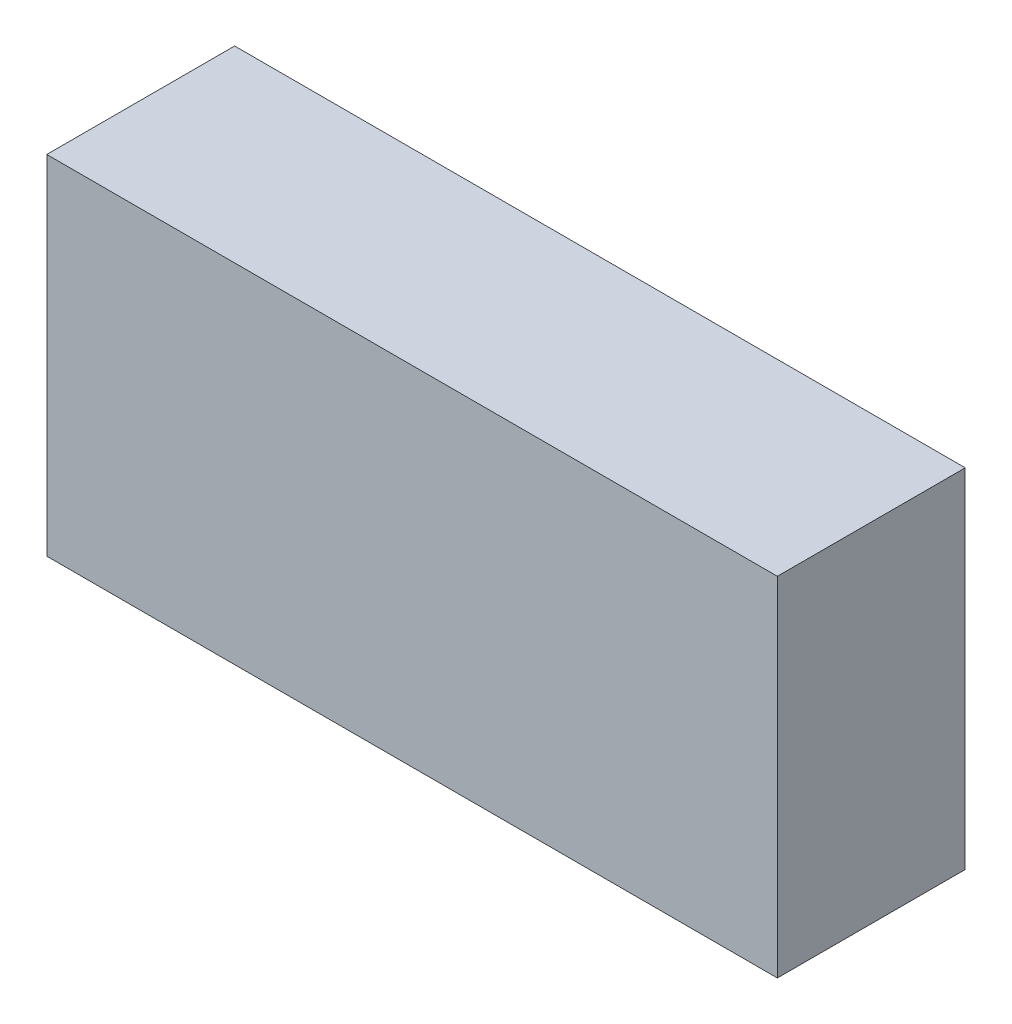
ISO-10303-21;
HEADER;
FILE_DESCRIPTION(('STEP AP214'),'2;1');
FILE_NAME('part.step','',(''),(''),'','','');
FILE_SCHEMA(('AUTOMOTIVE_DESIGN { 1 0 10303 214 1 1 1 1 }'));
ENDSEC;
DATA;
#1=APPLICATION_CONTEXT('core data for automotive mechanical design processes');
#2=APPLICATION_PROTOCOL_DEFINITION('international standard','automotive_design',2000,#1);
#3=PRODUCT_CONTEXT('',#1,'mechanical');
#4=PRODUCT('Part','Part','',(#3));
#5=PRODUCT_RELATED_PRODUCT_CATEGORY('part','',(#4));
#6=PRODUCT_DEFINITION_FORMATION('','',#4);
#7=PRODUCT_DEFINITION_CONTEXT('part definition',#1,'design');
#8=PRODUCT_DEFINITION('design','',#6,#7);
#9=PRODUCT_DEFINITION_SHAPE('','',#8);
#10=(LENGTH_UNIT() NAMED_UNIT(*) SI_UNIT(.MILLI.,.METRE.));
#11=(NAMED_UNIT(*) PLANE_ANGLE_UNIT() SI_UNIT($,.RADIAN.));
#12=(NAMED_UNIT(*) SI_UNIT($,.STERADIAN.) SOLID_ANGLE_UNIT());
#13=UNCERTAINTY_MEASURE_WITH_UNIT(LENGTH_MEASURE(1.E-05),#10,'distance_accuracy_value','');
#14=(GEOMETRIC_REPRESENTATION_CONTEXT(3) GLOBAL_UNCERTAINTY_ASSIGNED_CONTEXT((#13)) GLOBAL_UNIT_ASSIGNED_CONTEXT((#10,
#11,#12)) REPRESENTATION_CONTEXT('',''));
#15=CARTESIAN_POINT('',(0.,0.,0.));
#16=DIRECTION('',(0.,0.,1.));
#17=DIRECTION('',(1.,0.,0.));
#18=AXIS2_PLACEMENT_3D('',#15,#16,#17);
#19=CARTESIAN_POINT('',(0.,-0.25,0.024999999999999));
#20=DIRECTION('',(0.,0.,-1.));
#21=DIRECTION('',(0.,-1.,0.));
#22=AXIS2_PLACEMENT_3D('',#19,#20,#21);
#23=PLANE('',#22);
#24=DIRECTION('',(-1.,0.,0.));
#25=VECTOR('',#24,1.);
#26=CARTESIAN_POINT('',(0.,0.25,0.024999999999999));
#27=LINE('',#26,#25);
#28=CARTESIAN_POINT('',(0.525,0.25,0.024999999999999));
#29=VERTEX_POINT('',#28);
#30=CARTESIAN_POINT('',(-0.525,0.25,0.024999999999999));
#31=VERTEX_POINT('',#30);
#32=EDGE_CURVE('E42',#29,#31,#27,.T.);
#33=ORIENTED_EDGE('',*,*,#32,.F.);
#34=DIRECTION('',(0.,1.,0.));
#35=VECTOR('',#34,1.);
#36=CARTESIAN_POINT('',(0.525,-0.25,0.024999999999999));
#37=LINE('',#36,#35);
#38=CARTESIAN_POINT('',(0.525,-0.25,0.024999999999999));
#39=VERTEX_POINT('',#38);
#40=EDGE_CURVE('E80',#39,#29,#37,.T.);
#41=ORIENTED_EDGE('',*,*,#40,.F.);
#42=DIRECTION('',(-1.,0.,0.));
#43=VECTOR('',#42,1.);
#44=CARTESIAN_POINT('',(0.,-0.25,0.024999999999999));
#45=LINE('',#44,#43);
#46=CARTESIAN_POINT('',(-0.525,-0.25,0.024999999999999));
#47=VERTEX_POINT('',#46);
#48=EDGE_CURVE('E11',#39,#47,#45,.T.);
#49=ORIENTED_EDGE('',*,*,#48,.T.);
#50=DIRECTION('',(0.,1.,0.));
#51=VECTOR('',#50,1.);
#52=CARTESIAN_POINT('',(-0.525,-0.25,0.024999999999999));
#53=LINE('',#52,#51);
#54=EDGE_CURVE('E28',#47,#31,#53,.T.);
#55=ORIENTED_EDGE('',*,*,#54,.T.);
#56=EDGE_LOOP('',(#33,#41,#49,#55));
#57=FACE_BOUND('',#56,.T.);
#58=ADVANCED_FACE('F17',(#57),#23,.T.);
#59=CARTESIAN_POINT('',(0.,-0.25,0.16));
#60=DIRECTION('',(0.,-1.,0.));
#61=DIRECTION('',(0.,0.,-1.));
#62=AXIS2_PLACEMENT_3D('',#59,#60,#61);
#63=PLANE('',#62);
#64=DIRECTION('',(0.,0.,-1.));
#65=VECTOR('',#64,1.);
#66=CARTESIAN_POINT('',(0.525,-0.25,0.16));
#67=LINE('',#66,#65);
#68=CARTESIAN_POINT('',(0.525,-0.25,0.295));
#69=VERTEX_POINT('',#68);
#70=EDGE_CURVE('E84',#69,#39,#67,.T.);
#71=ORIENTED_EDGE('',*,*,#70,.F.);
#72=DIRECTION('',(1.,0.,0.));
#73=VECTOR('',#72,1.);
#74=CARTESIAN_POINT('',(0.,-0.25,0.295));
#75=LINE('',#74,#73);
#76=CARTESIAN_POINT('',(-0.525,-0.25,0.295));
#77=VERTEX_POINT('',#76);
#78=EDGE_CURVE('E68',#77,#69,#75,.T.);
#79=ORIENTED_EDGE('',*,*,#78,.F.);
#80=DIRECTION('',(0.,0.,-1.));
#81=VECTOR('',#80,1.);
#82=CARTESIAN_POINT('',(-0.525,-0.25,0.16));
#83=LINE('',#82,#81);
#84=EDGE_CURVE('E21',#77,#47,#83,.T.);
#85=ORIENTED_EDGE('',*,*,#84,.T.);
#86=ORIENTED_EDGE('',*,*,#48,.F.);
#87=EDGE_LOOP('',(#71,#79,#85,#86));
#88=FACE_BOUND('',#87,.T.);
#89=ADVANCED_FACE('F85',(#88),#63,.T.);
#90=CARTESIAN_POINT('',(-0.525,-0.25,0.16));
#91=DIRECTION('',(1.,0.,0.));
#92=DIRECTION('',(0.,0.,1.));
#93=AXIS2_PLACEMENT_3D('',#90,#91,#92);
#94=PLANE('',#93);
#95=DIRECTION('',(0.,0.,-1.));
#96=VECTOR('',#95,1.);
#97=CARTESIAN_POINT('',(-0.525,0.25,0.16));
#98=LINE('',#97,#96);
#99=CARTESIAN_POINT('',(-0.525,0.25,0.295));
#100=VERTEX_POINT('',#99);
#101=EDGE_CURVE('E109',#100,#31,#98,.T.);
#102=ORIENTED_EDGE('',*,*,#101,.T.);
#103=ORIENTED_EDGE('',*,*,#54,.F.);
#104=ORIENTED_EDGE('',*,*,#84,.F.);
#105=DIRECTION('',(0.,1.,0.));
#106=VECTOR('',#105,1.);
#107=CARTESIAN_POINT('',(-0.525,-0.25,0.295));
#108=LINE('',#107,#106);
#109=EDGE_CURVE('E75',#77,#100,#108,.T.);
#110=ORIENTED_EDGE('',*,*,#109,.T.);
#111=EDGE_LOOP('',(#102,#103,#104,#110));
#112=FACE_BOUND('',#111,.T.);
#113=ADVANCED_FACE('F166',(#112),#94,.F.);
#114=CARTESIAN_POINT('',(0.525,-0.25,0.16));
#115=DIRECTION('',(1.,0.,0.));
#116=DIRECTION('',(0.,0.,1.));
#117=AXIS2_PLACEMENT_3D('',#114,#115,#116);
#118=PLANE('',#117);
#119=DIRECTION('',(0.,0.,-1.));
#120=VECTOR('',#119,1.);
#121=CARTESIAN_POINT('',(0.525,0.25,0.16));
#122=LINE('',#121,#120);
#123=CARTESIAN_POINT('',(0.525,0.25,0.295));
#124=VERTEX_POINT('',#123);
#125=EDGE_CURVE('E92',#124,#29,#122,.T.);
#126=ORIENTED_EDGE('',*,*,#125,.F.);
#127=DIRECTION('',(0.,1.,0.));
#128=VECTOR('',#127,1.);
#129=CARTESIAN_POINT('',(0.525,-0.25,0.295));
#130=LINE('',#129,#128);
#131=EDGE_CURVE('E73',#69,#124,#130,.T.);
#132=ORIENTED_EDGE('',*,*,#131,.F.);
#133=ORIENTED_EDGE('',*,*,#70,.T.);
#134=ORIENTED_EDGE('',*,*,#40,.T.);
#135=EDGE_LOOP('',(#126,#132,#133,#134));
#136=FACE_BOUND('',#135,.T.);
#137=ADVANCED_FACE('F90',(#136),#118,.T.);
#138=CARTESIAN_POINT('',(0.,-0.25,0.295));
#139=DIRECTION('',(0.,0.,1.));
#140=DIRECTION('',(1.,0.,0.));
#141=AXIS2_PLACEMENT_3D('',#138,#139,#140);
#142=PLANE('',#141);
#143=DIRECTION('',(1.,0.,0.));
#144=VECTOR('',#143,1.);
#145=CARTESIAN_POINT('',(0.,0.25,0.295));
#146=LINE('',#145,#144);
#147=EDGE_CURVE('E103',#100,#124,#146,.T.);
#148=ORIENTED_EDGE('',*,*,#147,.F.);
#149=ORIENTED_EDGE('',*,*,#109,.F.);
#150=ORIENTED_EDGE('',*,*,#78,.T.);
#151=ORIENTED_EDGE('',*,*,#131,.T.);
#152=EDGE_LOOP('',(#148,#149,#150,#151));
#153=FACE_BOUND('',#152,.T.);
#154=ADVANCED_FACE('F71',(#153),#142,.T.);
#155=CARTESIAN_POINT('',(0.,0.25,0.16));
#156=DIRECTION('',(0.,-1.,0.));
#157=DIRECTION('',(0.,0.,-1.));
#158=AXIS2_PLACEMENT_3D('',#155,#156,#157);
#159=PLANE('',#158);
#160=ORIENTED_EDGE('',*,*,#125,.T.);
#161=ORIENTED_EDGE('',*,*,#32,.T.);
#162=ORIENTED_EDGE('',*,*,#101,.F.);
#163=ORIENTED_EDGE('',*,*,#147,.T.);
#164=EDGE_LOOP('',(#160,#161,#162,#163));
#165=FACE_BOUND('',#164,.T.);
#166=ADVANCED_FACE('F19',(#165),#159,.F.);
#167=CLOSED_SHELL('',(#58,#89,#113,#137,#154,#166));
#168=MANIFOLD_SOLID_BREP('B1',#167);
#169=ADVANCED_BREP_SHAPE_REPRESENTATION('',(#18,#168),#14);
#170=SHAPE_DEFINITION_REPRESENTATION(#9,#169);
ENDSEC;
END-ISO-10303-21;
